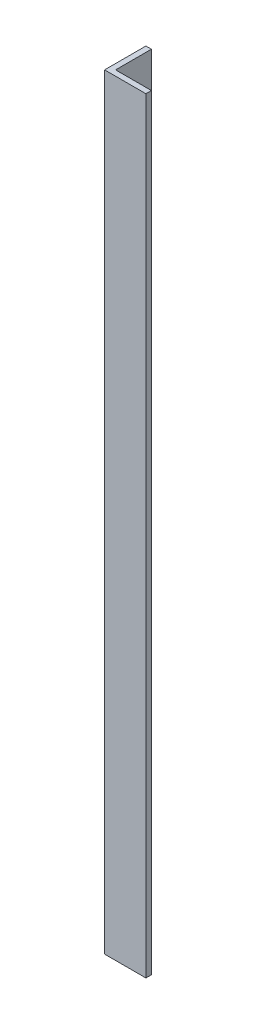
ISO-10303-21;
HEADER;
FILE_DESCRIPTION(('STEP AP214'),'2;1');
FILE_NAME('part.step','',(''),(''),'','','');
FILE_SCHEMA(('AUTOMOTIVE_DESIGN { 1 0 10303 214 1 1 1 1 }'));
ENDSEC;
DATA;
#1=APPLICATION_CONTEXT('core data for automotive mechanical design processes');
#2=APPLICATION_PROTOCOL_DEFINITION('international standard','automotive_design',2000,#1);
#3=PRODUCT_CONTEXT('',#1,'mechanical');
#4=PRODUCT('Part','Part','',(#3));
#5=PRODUCT_RELATED_PRODUCT_CATEGORY('part','',(#4));
#6=PRODUCT_DEFINITION_FORMATION('','',#4);
#7=PRODUCT_DEFINITION_CONTEXT('part definition',#1,'design');
#8=PRODUCT_DEFINITION('design','',#6,#7);
#9=PRODUCT_DEFINITION_SHAPE('','',#8);
#10=(LENGTH_UNIT() NAMED_UNIT(*) SI_UNIT(.MILLI.,.METRE.));
#11=(NAMED_UNIT(*) PLANE_ANGLE_UNIT() SI_UNIT($,.RADIAN.));
#12=(NAMED_UNIT(*) SI_UNIT($,.STERADIAN.) SOLID_ANGLE_UNIT());
#13=UNCERTAINTY_MEASURE_WITH_UNIT(LENGTH_MEASURE(1.E-05),#10,'distance_accuracy_value','');
#14=(GEOMETRIC_REPRESENTATION_CONTEXT(3) GLOBAL_UNCERTAINTY_ASSIGNED_CONTEXT((#13)) GLOBAL_UNIT_ASSIGNED_CONTEXT((#10,
#11,#12)) REPRESENTATION_CONTEXT('',''));
#15=CARTESIAN_POINT('',(0.,0.,0.));
#16=DIRECTION('',(0.,0.,1.));
#17=DIRECTION('',(1.,0.,0.));
#18=AXIS2_PLACEMENT_3D('',#15,#16,#17);
#19=CARTESIAN_POINT('',(0.,278.,-15.));
#20=DIRECTION('',(1.,0.,0.));
#21=DIRECTION('',(0.,0.,-1.));
#22=AXIS2_PLACEMENT_3D('',#19,#20,#21);
#23=PLANE('',#22);
#24=DIRECTION('',(0.,0.,1.));
#25=VECTOR('',#24,1.);
#26=CARTESIAN_POINT('',(0.,0.,-15.));
#27=LINE('',#26,#25);
#28=CARTESIAN_POINT('',(0.,0.,-15.));
#29=VERTEX_POINT('',#28);
#30=CARTESIAN_POINT('',(0.,0.,0.));
#31=VERTEX_POINT('',#30);
#32=EDGE_CURVE('E117',#29,#31,#27,.T.);
#33=ORIENTED_EDGE('',*,*,#32,.T.);
#34=DIRECTION('',(0.,-1.,0.));
#35=VECTOR('',#34,1.);
#36=CARTESIAN_POINT('',(0.,278.,0.));
#37=LINE('',#36,#35);
#38=CARTESIAN_POINT('',(0.,278.,0.));
#39=VERTEX_POINT('',#38);
#40=EDGE_CURVE('E11',#39,#31,#37,.T.);
#41=ORIENTED_EDGE('',*,*,#40,.F.);
#42=DIRECTION('',(0.,0.,1.));
#43=VECTOR('',#42,1.);
#44=CARTESIAN_POINT('',(0.,278.,-15.));
#45=LINE('',#44,#43);
#46=CARTESIAN_POINT('',(0.,278.,-15.));
#47=VERTEX_POINT('',#46);
#48=EDGE_CURVE('E127',#47,#39,#45,.T.);
#49=ORIENTED_EDGE('',*,*,#48,.F.);
#50=DIRECTION('',(0.,-1.,0.));
#51=VECTOR('',#50,1.);
#52=CARTESIAN_POINT('',(0.,278.,-15.));
#53=LINE('',#52,#51);
#54=EDGE_CURVE('E113',#47,#29,#53,.T.);
#55=ORIENTED_EDGE('',*,*,#54,.T.);
#56=EDGE_LOOP('',(#33,#41,#49,#55));
#57=FACE_BOUND('',#56,.T.);
#58=ADVANCED_FACE('F33',(#57),#23,.F.);
#59=CARTESIAN_POINT('',(0.,278.,0.));
#60=DIRECTION('',(0.,0.,-1.));
#61=DIRECTION('',(-1.,0.,0.));
#62=AXIS2_PLACEMENT_3D('',#59,#60,#61);
#63=PLANE('',#62);
#64=DIRECTION('',(1.,0.,0.));
#65=VECTOR('',#64,1.);
#66=CARTESIAN_POINT('',(0.,0.,0.));
#67=LINE('',#66,#65);
#68=CARTESIAN_POINT('',(15.,0.,0.));
#69=VERTEX_POINT('',#68);
#70=EDGE_CURVE('E120',#31,#69,#67,.T.);
#71=ORIENTED_EDGE('',*,*,#70,.T.);
#72=DIRECTION('',(0.,-1.,0.));
#73=VECTOR('',#72,1.);
#74=CARTESIAN_POINT('',(15.,278.,0.));
#75=LINE('',#74,#73);
#76=CARTESIAN_POINT('',(15.,278.,0.));
#77=VERTEX_POINT('',#76);
#78=EDGE_CURVE('E41',#77,#69,#75,.T.);
#79=ORIENTED_EDGE('',*,*,#78,.F.);
#80=DIRECTION('',(1.,0.,0.));
#81=VECTOR('',#80,1.);
#82=CARTESIAN_POINT('',(0.,278.,0.));
#83=LINE('',#82,#81);
#84=EDGE_CURVE('E86',#39,#77,#83,.T.);
#85=ORIENTED_EDGE('',*,*,#84,.F.);
#86=ORIENTED_EDGE('',*,*,#40,.T.);
#87=EDGE_LOOP('',(#71,#79,#85,#86));
#88=FACE_BOUND('',#87,.T.);
#89=ADVANCED_FACE('F151',(#88),#63,.F.);
#90=CARTESIAN_POINT('',(15.,278.,0.));
#91=DIRECTION('',(-1.,0.,0.));
#92=DIRECTION('',(0.,0.,1.));
#93=AXIS2_PLACEMENT_3D('',#90,#91,#92);
#94=PLANE('',#93);
#95=DIRECTION('',(0.,0.,-1.));
#96=VECTOR('',#95,1.);
#97=CARTESIAN_POINT('',(15.,0.,0.));
#98=LINE('',#97,#96);
#99=CARTESIAN_POINT('',(15.,0.,-2.));
#100=VERTEX_POINT('',#99);
#101=EDGE_CURVE('E122',#69,#100,#98,.T.);
#102=ORIENTED_EDGE('',*,*,#101,.T.);
#103=DIRECTION('',(0.,-1.,0.));
#104=VECTOR('',#103,1.);
#105=CARTESIAN_POINT('',(15.,278.,-2.));
#106=LINE('',#105,#104);
#107=CARTESIAN_POINT('',(15.,278.,-2.));
#108=VERTEX_POINT('',#107);
#109=EDGE_CURVE('E108',#108,#100,#106,.T.);
#110=ORIENTED_EDGE('',*,*,#109,.F.);
#111=DIRECTION('',(0.,0.,-1.));
#112=VECTOR('',#111,1.);
#113=CARTESIAN_POINT('',(15.,278.,0.));
#114=LINE('',#113,#112);
#115=EDGE_CURVE('E99',#77,#108,#114,.T.);
#116=ORIENTED_EDGE('',*,*,#115,.F.);
#117=ORIENTED_EDGE('',*,*,#78,.T.);
#118=EDGE_LOOP('',(#102,#110,#116,#117));
#119=FACE_BOUND('',#118,.T.);
#120=ADVANCED_FACE('F133',(#119),#94,.F.);
#121=CARTESIAN_POINT('',(15.,278.,-2.));
#122=DIRECTION('',(0.,0.,1.));
#123=DIRECTION('',(1.,0.,0.));
#124=AXIS2_PLACEMENT_3D('',#121,#122,#123);
#125=PLANE('',#124);
#126=DIRECTION('',(-1.,0.,0.));
#127=VECTOR('',#126,1.);
#128=CARTESIAN_POINT('',(15.,0.,-2.));
#129=LINE('',#128,#127);
#130=CARTESIAN_POINT('',(2.,0.,-2.));
#131=VERTEX_POINT('',#130);
#132=EDGE_CURVE('E107',#100,#131,#129,.T.);
#133=ORIENTED_EDGE('',*,*,#132,.T.);
#134=DIRECTION('',(0.,-1.,0.));
#135=VECTOR('',#134,1.);
#136=CARTESIAN_POINT('',(2.,278.,-2.));
#137=LINE('',#136,#135);
#138=CARTESIAN_POINT('',(2.,278.,-2.));
#139=VERTEX_POINT('',#138);
#140=EDGE_CURVE('E104',#139,#131,#137,.T.);
#141=ORIENTED_EDGE('',*,*,#140,.F.);
#142=DIRECTION('',(-1.,0.,0.));
#143=VECTOR('',#142,1.);
#144=CARTESIAN_POINT('',(15.,278.,-2.));
#145=LINE('',#144,#143);
#146=EDGE_CURVE('E93',#108,#139,#145,.T.);
#147=ORIENTED_EDGE('',*,*,#146,.F.);
#148=ORIENTED_EDGE('',*,*,#109,.T.);
#149=EDGE_LOOP('',(#133,#141,#147,#148));
#150=FACE_BOUND('',#149,.T.);
#151=ADVANCED_FACE('F105',(#150),#125,.F.);
#152=CARTESIAN_POINT('',(2.,278.,-2.));
#153=DIRECTION('',(-1.,0.,0.));
#154=DIRECTION('',(0.,0.,1.));
#155=AXIS2_PLACEMENT_3D('',#152,#153,#154);
#156=PLANE('',#155);
#157=DIRECTION('',(0.,0.,-1.));
#158=VECTOR('',#157,1.);
#159=CARTESIAN_POINT('',(2.,0.,-2.));
#160=LINE('',#159,#158);
#161=CARTESIAN_POINT('',(2.,0.,-15.));
#162=VERTEX_POINT('',#161);
#163=EDGE_CURVE('E72',#131,#162,#160,.T.);
#164=ORIENTED_EDGE('',*,*,#163,.T.);
#165=DIRECTION('',(0.,-1.,0.));
#166=VECTOR('',#165,1.);
#167=CARTESIAN_POINT('',(2.,278.,-15.));
#168=LINE('',#167,#166);
#169=CARTESIAN_POINT('',(2.,278.,-15.));
#170=VERTEX_POINT('',#169);
#171=EDGE_CURVE('E109',#170,#162,#168,.T.);
#172=ORIENTED_EDGE('',*,*,#171,.F.);
#173=DIRECTION('',(0.,0.,-1.));
#174=VECTOR('',#173,1.);
#175=CARTESIAN_POINT('',(2.,278.,-2.));
#176=LINE('',#175,#174);
#177=EDGE_CURVE('E97',#139,#170,#176,.T.);
#178=ORIENTED_EDGE('',*,*,#177,.F.);
#179=ORIENTED_EDGE('',*,*,#140,.T.);
#180=EDGE_LOOP('',(#164,#172,#178,#179));
#181=FACE_BOUND('',#180,.T.);
#182=ADVANCED_FACE('F111',(#181),#156,.F.);
#183=CARTESIAN_POINT('',(2.,278.,-15.));
#184=DIRECTION('',(0.,0.,1.));
#185=DIRECTION('',(1.,0.,0.));
#186=AXIS2_PLACEMENT_3D('',#183,#184,#185);
#187=PLANE('',#186);
#188=DIRECTION('',(-1.,0.,0.));
#189=VECTOR('',#188,1.);
#190=CARTESIAN_POINT('',(2.,0.,-15.));
#191=LINE('',#190,#189);
#192=EDGE_CURVE('E78',#162,#29,#191,.T.);
#193=ORIENTED_EDGE('',*,*,#192,.T.);
#194=ORIENTED_EDGE('',*,*,#54,.F.);
#195=DIRECTION('',(-1.,0.,0.));
#196=VECTOR('',#195,1.);
#197=CARTESIAN_POINT('',(2.,278.,-15.));
#198=LINE('',#197,#196);
#199=EDGE_CURVE('E49',#170,#47,#198,.T.);
#200=ORIENTED_EDGE('',*,*,#199,.F.);
#201=ORIENTED_EDGE('',*,*,#171,.T.);
#202=EDGE_LOOP('',(#193,#194,#200,#201));
#203=FACE_BOUND('',#202,.T.);
#204=ADVANCED_FACE('F140',(#203),#187,.F.);
#205=CARTESIAN_POINT('',(0.,278.,0.));
#206=DIRECTION('',(0.,1.,0.));
#207=DIRECTION('',(0.,0.,1.));
#208=AXIS2_PLACEMENT_3D('',#205,#206,#207);
#209=PLANE('',#208);
#210=ORIENTED_EDGE('',*,*,#48,.T.);
#211=ORIENTED_EDGE('',*,*,#84,.T.);
#212=ORIENTED_EDGE('',*,*,#115,.T.);
#213=ORIENTED_EDGE('',*,*,#146,.T.);
#214=ORIENTED_EDGE('',*,*,#177,.T.);
#215=ORIENTED_EDGE('',*,*,#199,.T.);
#216=EDGE_LOOP('',(#210,#211,#212,#213,#214,#215));
#217=FACE_BOUND('',#216,.T.);
#218=ADVANCED_FACE('F95',(#217),#209,.T.);
#219=CARTESIAN_POINT('',(0.,0.,0.));
#220=DIRECTION('',(0.,1.,0.));
#221=DIRECTION('',(0.,0.,1.));
#222=AXIS2_PLACEMENT_3D('',#219,#220,#221);
#223=PLANE('',#222);
#224=ORIENTED_EDGE('',*,*,#32,.F.);
#225=ORIENTED_EDGE('',*,*,#192,.F.);
#226=ORIENTED_EDGE('',*,*,#163,.F.);
#227=ORIENTED_EDGE('',*,*,#132,.F.);
#228=ORIENTED_EDGE('',*,*,#101,.F.);
#229=ORIENTED_EDGE('',*,*,#70,.F.);
#230=EDGE_LOOP('',(#224,#225,#226,#227,#228,#229));
#231=FACE_BOUND('',#230,.T.);
#232=ADVANCED_FACE('F136',(#231),#223,.F.);
#233=CLOSED_SHELL('',(#58,#89,#120,#151,#182,#204,#218,#232));
#234=MANIFOLD_SOLID_BREP('B2',#233);
#235=ADVANCED_BREP_SHAPE_REPRESENTATION('',(#18,#234),#14);
#236=SHAPE_DEFINITION_REPRESENTATION(#9,#235);
ENDSEC;
END-ISO-10303-21;
